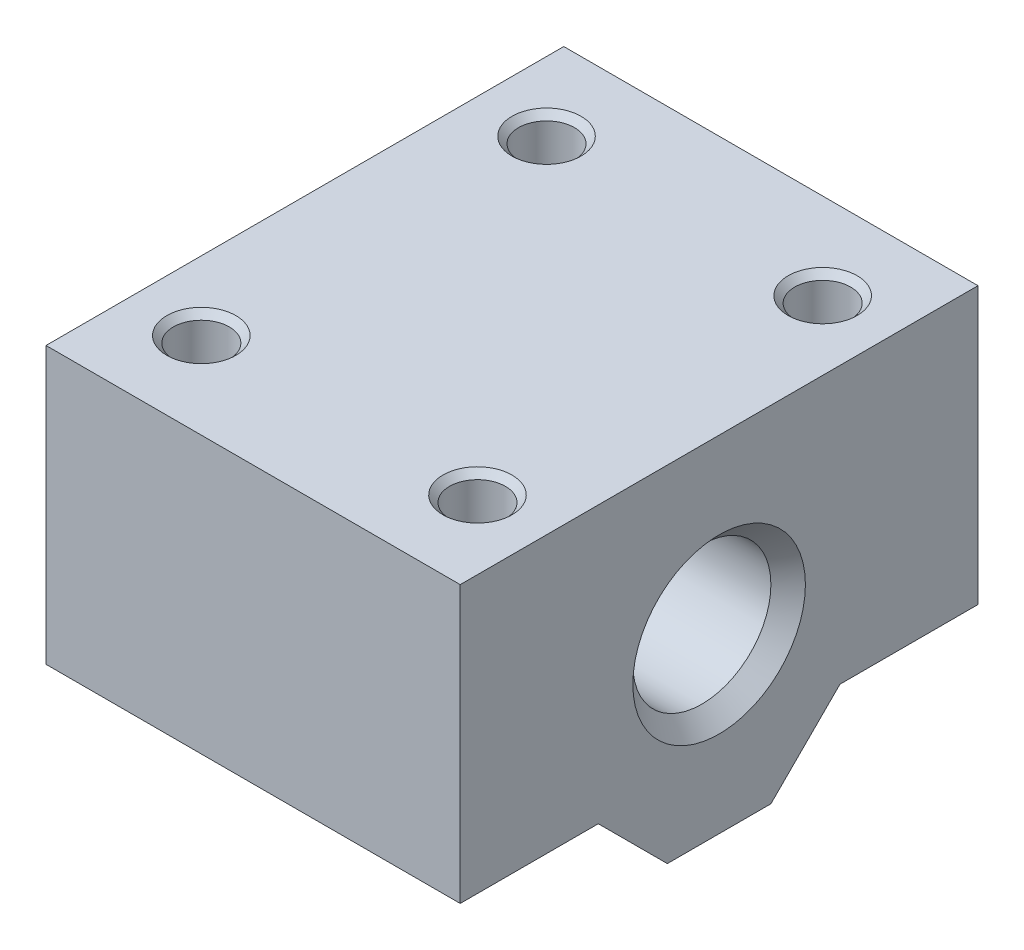
ISO-10303-21;
HEADER;
FILE_DESCRIPTION(('STEP AP214'),'2;1');
FILE_NAME('part.step','',(''),(''),'','','');
FILE_SCHEMA(('AUTOMOTIVE_DESIGN { 1 0 10303 214 1 1 1 1 }'));
ENDSEC;
DATA;
#1=APPLICATION_CONTEXT('core data for automotive mechanical design processes');
#2=APPLICATION_PROTOCOL_DEFINITION('international standard','automotive_design',2000,#1);
#3=PRODUCT_CONTEXT('',#1,'mechanical');
#4=PRODUCT('Part','Part','',(#3));
#5=PRODUCT_RELATED_PRODUCT_CATEGORY('part','',(#4));
#6=PRODUCT_DEFINITION_FORMATION('','',#4);
#7=PRODUCT_DEFINITION_CONTEXT('part definition',#1,'design');
#8=PRODUCT_DEFINITION('design','',#6,#7);
#9=PRODUCT_DEFINITION_SHAPE('','',#8);
#10=(LENGTH_UNIT() NAMED_UNIT(*) SI_UNIT(.MILLI.,.METRE.));
#11=(NAMED_UNIT(*) PLANE_ANGLE_UNIT() SI_UNIT($,.RADIAN.));
#12=(NAMED_UNIT(*) SI_UNIT($,.STERADIAN.) SOLID_ANGLE_UNIT());
#13=UNCERTAINTY_MEASURE_WITH_UNIT(LENGTH_MEASURE(1.E-05),#10,'distance_accuracy_value','');
#14=(GEOMETRIC_REPRESENTATION_CONTEXT(3) GLOBAL_UNCERTAINTY_ASSIGNED_CONTEXT((#13)) GLOBAL_UNIT_ASSIGNED_CONTEXT((#10,
#11,#12)) REPRESENTATION_CONTEXT('',''));
#15=CARTESIAN_POINT('',(0.,0.,0.));
#16=DIRECTION('',(0.,0.,1.));
#17=DIRECTION('',(1.,0.,0.));
#18=AXIS2_PLACEMENT_3D('',#15,#16,#17);
#19=CARTESIAN_POINT('',(24.,-10.,-15.));
#20=DIRECTION('',(0.,0.,-1.));
#21=DIRECTION('',(-1.,0.,0.));
#22=AXIS2_PLACEMENT_3D('',#19,#20,#21);
#23=PLANE('',#22);
#24=DIRECTION('',(1.,0.,0.));
#25=VECTOR('',#24,1.);
#26=CARTESIAN_POINT('',(0.,-6.,-15.));
#27=LINE('',#26,#25);
#28=CARTESIAN_POINT('',(0.,-6.,-15.));
#29=VERTEX_POINT('',#28);
#30=CARTESIAN_POINT('',(24.,-6.,-15.));
#31=VERTEX_POINT('',#30);
#32=EDGE_CURVE('E157',#29,#31,#27,.T.);
#33=ORIENTED_EDGE('',*,*,#32,.F.);
#34=DIRECTION('',(0.,1.,0.));
#35=VECTOR('',#34,1.);
#36=CARTESIAN_POINT('',(0.,-10.,-15.));
#37=LINE('',#36,#35);
#38=CARTESIAN_POINT('',(0.,10.,-15.));
#39=VERTEX_POINT('',#38);
#40=EDGE_CURVE('E128',#29,#39,#37,.T.);
#41=ORIENTED_EDGE('',*,*,#40,.T.);
#42=DIRECTION('',(-1.,0.,0.));
#43=VECTOR('',#42,1.);
#44=CARTESIAN_POINT('',(24.,10.,-15.));
#45=LINE('',#44,#43);
#46=CARTESIAN_POINT('',(24.,10.,-15.));
#47=VERTEX_POINT('',#46);
#48=EDGE_CURVE('E126',#47,#39,#45,.T.);
#49=ORIENTED_EDGE('',*,*,#48,.F.);
#50=DIRECTION('',(0.,1.,0.));
#51=VECTOR('',#50,1.);
#52=CARTESIAN_POINT('',(24.,-10.,-15.));
#53=LINE('',#52,#51);
#54=EDGE_CURVE('E111',#31,#47,#53,.T.);
#55=ORIENTED_EDGE('',*,*,#54,.F.);
#56=EDGE_LOOP('',(#33,#41,#49,#55));
#57=FACE_BOUND('',#56,.T.);
#58=ADVANCED_FACE('F41',(#57),#23,.T.);
#59=CARTESIAN_POINT('',(24.,-10.,15.));
#60=DIRECTION('',(1.,0.,0.));
#61=DIRECTION('',(0.,0.,-1.));
#62=AXIS2_PLACEMENT_3D('',#59,#60,#61);
#63=PLANE('',#62);
#64=CARTESIAN_POINT('',(24.,0.,0.));
#65=DIRECTION('',(1.,0.,0.));
#66=DIRECTION('',(0.,0.,-1.));
#67=AXIS2_PLACEMENT_3D('',#64,#65,#66);
#68=CIRCLE('',#67,4.99999999999999);
#69=CARTESIAN_POINT('',(24.,0.,-4.99999999999999));
#70=VERTEX_POINT('',#69);
#71=EDGE_CURVE('E199',#70,#70,#68,.F.);
#72=ORIENTED_EDGE('',*,*,#71,.T.);
#73=EDGE_LOOP('',(#72));
#74=FACE_BOUND('',#73,.T.);
#75=DIRECTION('',(0.,0.,1.));
#76=VECTOR('',#75,1.);
#77=CARTESIAN_POINT('',(24.,-6.,3.));
#78=LINE('',#77,#76);
#79=CARTESIAN_POINT('',(24.,-6.,7.00000000000003));
#80=VERTEX_POINT('',#79);
#81=CARTESIAN_POINT('',(24.,-6.,15.));
#82=VERTEX_POINT('',#81);
#83=EDGE_CURVE('E87',#80,#82,#78,.T.);
#84=ORIENTED_EDGE('',*,*,#83,.F.);
#85=DIRECTION('',(0.,-0.707106781186545,-0.70710678118655));
#86=VECTOR('',#85,1.);
#87=CARTESIAN_POINT('',(24.,-4.,9.00000000000004));
#88=LINE('',#87,#86);
#89=CARTESIAN_POINT('',(24.,-10.,3.));
#90=VERTEX_POINT('',#89);
#91=EDGE_CURVE('E161',#90,#80,#88,.F.);
#92=ORIENTED_EDGE('',*,*,#91,.F.);
#93=DIRECTION('',(0.,0.,-1.));
#94=VECTOR('',#93,1.);
#95=CARTESIAN_POINT('',(24.,-10.,15.));
#96=LINE('',#95,#94);
#97=CARTESIAN_POINT('',(24.,-10.,-3.));
#98=VERTEX_POINT('',#97);
#99=EDGE_CURVE('E142',#90,#98,#96,.T.);
#100=ORIENTED_EDGE('',*,*,#99,.T.);
#101=DIRECTION('',(0.,0.707106781186545,-0.70710678118655));
#102=VECTOR('',#101,1.);
#103=CARTESIAN_POINT('',(24.,-19.,6.00000000000006));
#104=LINE('',#103,#102);
#105=CARTESIAN_POINT('',(24.,-6.,-7.00000000000003));
#106=VERTEX_POINT('',#105);
#107=EDGE_CURVE('E151',#106,#98,#104,.F.);
#108=ORIENTED_EDGE('',*,*,#107,.F.);
#109=DIRECTION('',(0.,0.,1.));
#110=VECTOR('',#109,1.);
#111=CARTESIAN_POINT('',(24.,-6.,-15.));
#112=LINE('',#111,#110);
#113=EDGE_CURVE('E119',#31,#106,#112,.T.);
#114=ORIENTED_EDGE('',*,*,#113,.F.);
#115=ORIENTED_EDGE('',*,*,#54,.T.);
#116=DIRECTION('',(0.,0.,-1.));
#117=VECTOR('',#116,1.);
#118=CARTESIAN_POINT('',(24.,10.,15.));
#119=LINE('',#118,#117);
#120=CARTESIAN_POINT('',(24.,10.,15.));
#121=VERTEX_POINT('',#120);
#122=EDGE_CURVE('E116',#121,#47,#119,.T.);
#123=ORIENTED_EDGE('',*,*,#122,.F.);
#124=DIRECTION('',(0.,1.,0.));
#125=VECTOR('',#124,1.);
#126=CARTESIAN_POINT('',(24.,-10.,15.));
#127=LINE('',#126,#125);
#128=EDGE_CURVE('E123',#82,#121,#127,.T.);
#129=ORIENTED_EDGE('',*,*,#128,.F.);
#130=EDGE_LOOP('',(#84,#92,#100,#108,#114,#115,#123,#129));
#131=FACE_BOUND('',#130,.T.);
#132=ADVANCED_FACE('F113',(#74,#131),#63,.T.);
#133=CARTESIAN_POINT('',(0.,-10.,15.));
#134=DIRECTION('',(0.,0.,1.));
#135=DIRECTION('',(1.,0.,0.));
#136=AXIS2_PLACEMENT_3D('',#133,#134,#135);
#137=PLANE('',#136);
#138=DIRECTION('',(1.,0.,0.));
#139=VECTOR('',#138,1.);
#140=CARTESIAN_POINT('',(0.,-6.,15.));
#141=LINE('',#140,#139);
#142=CARTESIAN_POINT('',(0.,-6.,15.));
#143=VERTEX_POINT('',#142);
#144=EDGE_CURVE('E167',#143,#82,#141,.T.);
#145=ORIENTED_EDGE('',*,*,#144,.T.);
#146=ORIENTED_EDGE('',*,*,#128,.T.);
#147=DIRECTION('',(1.,0.,0.));
#148=VECTOR('',#147,1.);
#149=CARTESIAN_POINT('',(0.,10.,15.));
#150=LINE('',#149,#148);
#151=CARTESIAN_POINT('',(0.,10.,15.));
#152=VERTEX_POINT('',#151);
#153=EDGE_CURVE('E138',#152,#121,#150,.T.);
#154=ORIENTED_EDGE('',*,*,#153,.F.);
#155=DIRECTION('',(0.,1.,0.));
#156=VECTOR('',#155,1.);
#157=CARTESIAN_POINT('',(0.,-10.,15.));
#158=LINE('',#157,#156);
#159=EDGE_CURVE('E148',#143,#152,#158,.T.);
#160=ORIENTED_EDGE('',*,*,#159,.F.);
#161=EDGE_LOOP('',(#145,#146,#154,#160));
#162=FACE_BOUND('',#161,.T.);
#163=ADVANCED_FACE('F217',(#162),#137,.T.);
#164=CARTESIAN_POINT('',(0.,-10.,-15.));
#165=DIRECTION('',(-1.,0.,0.));
#166=DIRECTION('',(0.,0.,1.));
#167=AXIS2_PLACEMENT_3D('',#164,#165,#166);
#168=PLANE('',#167);
#169=CARTESIAN_POINT('',(0.,0.,0.));
#170=DIRECTION('',(-1.,0.,0.));
#171=DIRECTION('',(0.,0.,1.));
#172=AXIS2_PLACEMENT_3D('',#169,#170,#171);
#173=CIRCLE('',#172,5.);
#174=CARTESIAN_POINT('',(0.,0.,5.));
#175=VERTEX_POINT('',#174);
#176=EDGE_CURVE('E11',#175,#175,#173,.F.);
#177=ORIENTED_EDGE('',*,*,#176,.T.);
#178=EDGE_LOOP('',(#177));
#179=FACE_BOUND('',#178,.T.);
#180=DIRECTION('',(0.,0.,1.));
#181=VECTOR('',#180,1.);
#182=CARTESIAN_POINT('',(0.,-6.,3.));
#183=LINE('',#182,#181);
#184=CARTESIAN_POINT('',(0.,-6.,7.00000000000003));
#185=VERTEX_POINT('',#184);
#186=EDGE_CURVE('E165',#185,#143,#183,.T.);
#187=ORIENTED_EDGE('',*,*,#186,.T.);
#188=ORIENTED_EDGE('',*,*,#159,.T.);
#189=DIRECTION('',(0.,0.,1.));
#190=VECTOR('',#189,1.);
#191=CARTESIAN_POINT('',(0.,10.,-15.));
#192=LINE('',#191,#190);
#193=EDGE_CURVE('E132',#39,#152,#192,.T.);
#194=ORIENTED_EDGE('',*,*,#193,.F.);
#195=ORIENTED_EDGE('',*,*,#40,.F.);
#196=DIRECTION('',(0.,0.,1.));
#197=VECTOR('',#196,1.);
#198=CARTESIAN_POINT('',(0.,-6.,-15.));
#199=LINE('',#198,#197);
#200=CARTESIAN_POINT('',(0.,-6.,-7.00000000000003));
#201=VERTEX_POINT('',#200);
#202=EDGE_CURVE('E154',#29,#201,#199,.T.);
#203=ORIENTED_EDGE('',*,*,#202,.T.);
#204=DIRECTION('',(0.,0.707106781186545,-0.70710678118655));
#205=VECTOR('',#204,1.);
#206=CARTESIAN_POINT('',(0.,-10.,-3.));
#207=LINE('',#206,#205);
#208=CARTESIAN_POINT('',(0.,-10.,-3.));
#209=VERTEX_POINT('',#208);
#210=EDGE_CURVE('E158',#201,#209,#207,.F.);
#211=ORIENTED_EDGE('',*,*,#210,.T.);
#212=DIRECTION('',(0.,0.,1.));
#213=VECTOR('',#212,1.);
#214=CARTESIAN_POINT('',(0.,-10.,-15.));
#215=LINE('',#214,#213);
#216=CARTESIAN_POINT('',(0.,-10.,3.));
#217=VERTEX_POINT('',#216);
#218=EDGE_CURVE('E139',#209,#217,#215,.T.);
#219=ORIENTED_EDGE('',*,*,#218,.T.);
#220=DIRECTION('',(0.,-0.707106781186545,-0.70710678118655));
#221=VECTOR('',#220,1.);
#222=CARTESIAN_POINT('',(0.,-10.,3.));
#223=LINE('',#222,#221);
#224=EDGE_CURVE('E59',#217,#185,#223,.F.);
#225=ORIENTED_EDGE('',*,*,#224,.T.);
#226=EDGE_LOOP('',(#187,#188,#194,#195,#203,#211,#219,#225));
#227=FACE_BOUND('',#226,.T.);
#228=ADVANCED_FACE('F223',(#179,#227),#168,.T.);
#229=CARTESIAN_POINT('',(0.,-10.,0.));
#230=DIRECTION('',(0.,1.,0.));
#231=DIRECTION('',(0.,0.,1.));
#232=AXIS2_PLACEMENT_3D('',#229,#230,#231);
#233=PLANE('',#232);
#234=ORIENTED_EDGE('',*,*,#99,.F.);
#235=DIRECTION('',(1.,0.,0.));
#236=VECTOR('',#235,1.);
#237=CARTESIAN_POINT('',(0.,-10.,3.));
#238=LINE('',#237,#236);
#239=EDGE_CURVE('E168',#217,#90,#238,.T.);
#240=ORIENTED_EDGE('',*,*,#239,.F.);
#241=ORIENTED_EDGE('',*,*,#218,.F.);
#242=DIRECTION('',(1.,0.,0.));
#243=VECTOR('',#242,1.);
#244=CARTESIAN_POINT('',(0.,-10.,-3.));
#245=LINE('',#244,#243);
#246=EDGE_CURVE('E133',#209,#98,#245,.T.);
#247=ORIENTED_EDGE('',*,*,#246,.T.);
#248=EDGE_LOOP('',(#234,#240,#241,#247));
#249=FACE_BOUND('',#248,.T.);
#250=ADVANCED_FACE('F231',(#249),#233,.F.);
#251=CARTESIAN_POINT('',(0.,10.,0.));
#252=DIRECTION('',(0.,1.,0.));
#253=DIRECTION('',(0.,0.,1.));
#254=AXIS2_PLACEMENT_3D('',#251,#252,#253);
#255=PLANE('',#254);
#256=CARTESIAN_POINT('',(20.,10.,-10.));
#257=DIRECTION('',(0.,1.,0.));
#258=DIRECTION('',(0.,0.,1.));
#259=AXIS2_PLACEMENT_3D('',#256,#257,#258);
#260=CIRCLE('',#259,1.99999999999998);
#261=CARTESIAN_POINT('',(20.,10.,-8.00000000000002));
#262=VERTEX_POINT('',#261);
#263=EDGE_CURVE('E187',#262,#262,#260,.F.);
#264=ORIENTED_EDGE('',*,*,#263,.T.);
#265=EDGE_LOOP('',(#264));
#266=FACE_BOUND('',#265,.T.);
#267=CARTESIAN_POINT('',(4.,10.,10.));
#268=DIRECTION('',(0.,1.,0.));
#269=DIRECTION('',(0.,0.,1.));
#270=AXIS2_PLACEMENT_3D('',#267,#268,#269);
#271=CIRCLE('',#270,2.00000000000001);
#272=CARTESIAN_POINT('',(4.,10.,12.));
#273=VERTEX_POINT('',#272);
#274=EDGE_CURVE('E184',#273,#273,#271,.F.);
#275=ORIENTED_EDGE('',*,*,#274,.T.);
#276=EDGE_LOOP('',(#275));
#277=FACE_BOUND('',#276,.T.);
#278=CARTESIAN_POINT('',(20.,10.,10.));
#279=DIRECTION('',(0.,1.,0.));
#280=DIRECTION('',(0.,0.,1.));
#281=AXIS2_PLACEMENT_3D('',#278,#279,#280);
#282=CIRCLE('',#281,2.00000000000001);
#283=CARTESIAN_POINT('',(20.,10.,12.));
#284=VERTEX_POINT('',#283);
#285=EDGE_CURVE('E181',#284,#284,#282,.F.);
#286=ORIENTED_EDGE('',*,*,#285,.T.);
#287=EDGE_LOOP('',(#286));
#288=FACE_BOUND('',#287,.T.);
#289=CARTESIAN_POINT('',(4.,10.,-10.));
#290=DIRECTION('',(0.,1.,0.));
#291=DIRECTION('',(0.,0.,1.));
#292=AXIS2_PLACEMENT_3D('',#289,#290,#291);
#293=CIRCLE('',#292,1.99999999999998);
#294=CARTESIAN_POINT('',(4.,10.,-8.00000000000002));
#295=VERTEX_POINT('',#294);
#296=EDGE_CURVE('E178',#295,#295,#293,.F.);
#297=ORIENTED_EDGE('',*,*,#296,.T.);
#298=EDGE_LOOP('',(#297));
#299=FACE_BOUND('',#298,.T.);
#300=ORIENTED_EDGE('',*,*,#48,.T.);
#301=ORIENTED_EDGE('',*,*,#193,.T.);
#302=ORIENTED_EDGE('',*,*,#153,.T.);
#303=ORIENTED_EDGE('',*,*,#122,.T.);
#304=EDGE_LOOP('',(#300,#301,#302,#303));
#305=FACE_BOUND('',#304,.T.);
#306=ADVANCED_FACE('F136',(#266,#277,#288,#299,#305),#255,.T.);
#307=CARTESIAN_POINT('',(0.,-10.,-3.));
#308=DIRECTION('',(0.,-0.70710678118655,-0.707106781186545));
#309=DIRECTION('',(0.,0.707106781186545,-0.70710678118655));
#310=AXIS2_PLACEMENT_3D('',#307,#308,#309);
#311=PLANE('',#310);
#312=ORIENTED_EDGE('',*,*,#107,.T.);
#313=ORIENTED_EDGE('',*,*,#246,.F.);
#314=ORIENTED_EDGE('',*,*,#210,.F.);
#315=DIRECTION('',(-1.,0.,0.));
#316=VECTOR('',#315,1.);
#317=CARTESIAN_POINT('',(0.,-6.,-7.00000000000003));
#318=LINE('',#317,#316);
#319=EDGE_CURVE('E155',#201,#106,#318,.F.);
#320=ORIENTED_EDGE('',*,*,#319,.T.);
#321=EDGE_LOOP('',(#312,#313,#314,#320));
#322=FACE_BOUND('',#321,.T.);
#323=ADVANCED_FACE('F234',(#322),#311,.T.);
#324=CARTESIAN_POINT('',(0.,-6.,-15.));
#325=DIRECTION('',(0.,1.,0.));
#326=DIRECTION('',(0.,0.,1.));
#327=AXIS2_PLACEMENT_3D('',#324,#325,#326);
#328=PLANE('',#327);
#329=CARTESIAN_POINT('',(4.,-6.,-10.));
#330=DIRECTION('',(0.,1.,0.));
#331=DIRECTION('',(0.,0.,1.));
#332=AXIS2_PLACEMENT_3D('',#329,#330,#331);
#333=CIRCLE('',#332,1.62099999999999);
#334=CARTESIAN_POINT('',(4.,-6.,-8.37900000000002));
#335=VERTEX_POINT('',#334);
#336=EDGE_CURVE('E171',#335,#335,#333,.T.);
#337=ORIENTED_EDGE('',*,*,#336,.T.);
#338=EDGE_LOOP('',(#337));
#339=FACE_BOUND('',#338,.T.);
#340=CARTESIAN_POINT('',(20.,-6.,-10.));
#341=DIRECTION('',(0.,1.,0.));
#342=DIRECTION('',(0.,0.,1.));
#343=AXIS2_PLACEMENT_3D('',#340,#341,#342);
#344=CIRCLE('',#343,1.62099999999999);
#345=CARTESIAN_POINT('',(20.,-6.,-8.37900000000002));
#346=VERTEX_POINT('',#345);
#347=EDGE_CURVE('E163',#346,#346,#344,.T.);
#348=ORIENTED_EDGE('',*,*,#347,.T.);
#349=EDGE_LOOP('',(#348));
#350=FACE_BOUND('',#349,.T.);
#351=ORIENTED_EDGE('',*,*,#113,.T.);
#352=ORIENTED_EDGE('',*,*,#319,.F.);
#353=ORIENTED_EDGE('',*,*,#202,.F.);
#354=ORIENTED_EDGE('',*,*,#32,.T.);
#355=EDGE_LOOP('',(#351,#352,#353,#354));
#356=FACE_BOUND('',#355,.T.);
#357=ADVANCED_FACE('F237',(#339,#350,#356),#328,.F.);
#358=CARTESIAN_POINT('',(0.,-6.,3.));
#359=DIRECTION('',(0.,1.,0.));
#360=DIRECTION('',(0.,0.,1.));
#361=AXIS2_PLACEMENT_3D('',#358,#359,#360);
#362=PLANE('',#361);
#363=CARTESIAN_POINT('',(20.,-6.,10.));
#364=DIRECTION('',(0.,1.,0.));
#365=DIRECTION('',(0.,0.,1.));
#366=AXIS2_PLACEMENT_3D('',#363,#364,#365);
#367=CIRCLE('',#366,1.62099999999999);
#368=CARTESIAN_POINT('',(20.,-6.,11.621));
#369=VERTEX_POINT('',#368);
#370=EDGE_CURVE('E172',#369,#369,#367,.T.);
#371=ORIENTED_EDGE('',*,*,#370,.T.);
#372=EDGE_LOOP('',(#371));
#373=FACE_BOUND('',#372,.T.);
#374=CARTESIAN_POINT('',(4.,-6.,10.));
#375=DIRECTION('',(0.,1.,0.));
#376=DIRECTION('',(0.,0.,1.));
#377=AXIS2_PLACEMENT_3D('',#374,#375,#376);
#378=CIRCLE('',#377,1.62099999999999);
#379=CARTESIAN_POINT('',(4.,-6.,11.621));
#380=VERTEX_POINT('',#379);
#381=EDGE_CURVE('E175',#380,#380,#378,.T.);
#382=ORIENTED_EDGE('',*,*,#381,.T.);
#383=EDGE_LOOP('',(#382));
#384=FACE_BOUND('',#383,.T.);
#385=ORIENTED_EDGE('',*,*,#83,.T.);
#386=ORIENTED_EDGE('',*,*,#144,.F.);
#387=ORIENTED_EDGE('',*,*,#186,.F.);
#388=DIRECTION('',(-1.,0.,0.));
#389=VECTOR('',#388,1.);
#390=CARTESIAN_POINT('',(0.,-6.,7.00000000000003));
#391=LINE('',#390,#389);
#392=EDGE_CURVE('E79',#185,#80,#391,.F.);
#393=ORIENTED_EDGE('',*,*,#392,.T.);
#394=EDGE_LOOP('',(#385,#386,#387,#393));
#395=FACE_BOUND('',#394,.T.);
#396=ADVANCED_FACE('F242',(#373,#384,#395),#362,.F.);
#397=CARTESIAN_POINT('',(0.,-10.,3.));
#398=DIRECTION('',(0.,-0.70710678118655,0.707106781186545));
#399=DIRECTION('',(0.,-0.707106781186545,-0.70710678118655));
#400=AXIS2_PLACEMENT_3D('',#397,#398,#399);
#401=PLANE('',#400);
#402=ORIENTED_EDGE('',*,*,#91,.T.);
#403=ORIENTED_EDGE('',*,*,#392,.F.);
#404=ORIENTED_EDGE('',*,*,#224,.F.);
#405=ORIENTED_EDGE('',*,*,#239,.T.);
#406=EDGE_LOOP('',(#402,#403,#404,#405));
#407=FACE_BOUND('',#406,.T.);
#408=ADVANCED_FACE('F239',(#407),#401,.T.);
#409=CARTESIAN_POINT('',(0.,0.,0.));
#410=DIRECTION('',(-1.,0.,0.));
#411=DIRECTION('',(0.,0.,1.));
#412=AXIS2_PLACEMENT_3D('',#409,#410,#411);
#413=CYLINDRICAL_SURFACE('',#412,3.99999999999999);
#414=CARTESIAN_POINT('',(23.,0.,0.));
#415=DIRECTION('',(1.,0.,0.));
#416=DIRECTION('',(0.,0.,-1.));
#417=AXIS2_PLACEMENT_3D('',#414,#415,#416);
#418=CIRCLE('',#417,3.99999999999999);
#419=CARTESIAN_POINT('',(23.,0.,-3.99999999999999));
#420=VERTEX_POINT('',#419);
#421=EDGE_CURVE('E51',#420,#420,#418,.T.);
#422=ORIENTED_EDGE('',*,*,#421,.T.);
#423=EDGE_LOOP('',(#422));
#424=FACE_BOUND('',#423,.T.);
#425=CARTESIAN_POINT('',(1.,0.,0.));
#426=DIRECTION('',(-1.,0.,0.));
#427=DIRECTION('',(0.,0.,1.));
#428=AXIS2_PLACEMENT_3D('',#425,#426,#427);
#429=CIRCLE('',#428,3.99999999999999);
#430=CARTESIAN_POINT('',(1.,0.,3.99999999999999));
#431=VERTEX_POINT('',#430);
#432=EDGE_CURVE('E202',#431,#431,#429,.T.);
#433=ORIENTED_EDGE('',*,*,#432,.T.);
#434=EDGE_LOOP('',(#433));
#435=FACE_BOUND('',#434,.T.);
#436=ADVANCED_FACE('F207',(#424,#435),#413,.F.);
#437=CARTESIAN_POINT('',(20.,10.,-10.));
#438=DIRECTION('',(0.,1.,0.));
#439=DIRECTION('',(0.,0.,1.));
#440=AXIS2_PLACEMENT_3D('',#437,#438,#439);
#441=CYLINDRICAL_SURFACE('',#440,1.62099999999999);
#442=CARTESIAN_POINT('',(20.,9.62100000000001,-10.));
#443=DIRECTION('',(0.,1.,0.));
#444=DIRECTION('',(0.,0.,1.));
#445=AXIS2_PLACEMENT_3D('',#442,#443,#444);
#446=CIRCLE('',#445,1.62099999999999);
#447=CARTESIAN_POINT('',(20.,9.62100000000001,-8.37900000000002));
#448=VERTEX_POINT('',#447);
#449=EDGE_CURVE('E122',#448,#448,#446,.T.);
#450=ORIENTED_EDGE('',*,*,#449,.T.);
#451=EDGE_LOOP('',(#450));
#452=FACE_BOUND('',#451,.T.);
#453=ORIENTED_EDGE('',*,*,#347,.F.);
#454=EDGE_LOOP('',(#453));
#455=FACE_BOUND('',#454,.T.);
#456=ADVANCED_FACE('F285',(#452,#455),#441,.F.);
#457=CARTESIAN_POINT('',(4.,10.,-10.));
#458=DIRECTION('',(0.,1.,0.));
#459=DIRECTION('',(0.,0.,1.));
#460=AXIS2_PLACEMENT_3D('',#457,#458,#459);
#461=CYLINDRICAL_SURFACE('',#460,1.62099999999999);
#462=CARTESIAN_POINT('',(4.,9.62100000000001,-10.));
#463=DIRECTION('',(0.,1.,0.));
#464=DIRECTION('',(0.,0.,1.));
#465=AXIS2_PLACEMENT_3D('',#462,#463,#464);
#466=CIRCLE('',#465,1.62099999999999);
#467=CARTESIAN_POINT('',(4.,9.62100000000001,-8.37900000000002));
#468=VERTEX_POINT('',#467);
#469=EDGE_CURVE('E196',#468,#468,#466,.T.);
#470=ORIENTED_EDGE('',*,*,#469,.T.);
#471=EDGE_LOOP('',(#470));
#472=FACE_BOUND('',#471,.T.);
#473=ORIENTED_EDGE('',*,*,#336,.F.);
#474=EDGE_LOOP('',(#473));
#475=FACE_BOUND('',#474,.T.);
#476=ADVANCED_FACE('F281',(#472,#475),#461,.F.);
#477=CARTESIAN_POINT('',(4.,10.,10.));
#478=DIRECTION('',(0.,1.,0.));
#479=DIRECTION('',(0.,0.,1.));
#480=AXIS2_PLACEMENT_3D('',#477,#478,#479);
#481=CYLINDRICAL_SURFACE('',#480,1.62099999999999);
#482=CARTESIAN_POINT('',(4.,9.62099999999999,10.));
#483=DIRECTION('',(0.,1.,0.));
#484=DIRECTION('',(0.,0.,1.));
#485=AXIS2_PLACEMENT_3D('',#482,#483,#484);
#486=CIRCLE('',#485,1.62099999999999);
#487=CARTESIAN_POINT('',(4.,9.62099999999999,11.621));
#488=VERTEX_POINT('',#487);
#489=EDGE_CURVE('E190',#488,#488,#486,.T.);
#490=ORIENTED_EDGE('',*,*,#489,.T.);
#491=EDGE_LOOP('',(#490));
#492=FACE_BOUND('',#491,.T.);
#493=ORIENTED_EDGE('',*,*,#381,.F.);
#494=EDGE_LOOP('',(#493));
#495=FACE_BOUND('',#494,.T.);
#496=ADVANCED_FACE('F284',(#492,#495),#481,.F.);
#497=CARTESIAN_POINT('',(20.,10.,10.));
#498=DIRECTION('',(0.,1.,0.));
#499=DIRECTION('',(0.,0.,1.));
#500=AXIS2_PLACEMENT_3D('',#497,#498,#499);
#501=CYLINDRICAL_SURFACE('',#500,1.62099999999999);
#502=CARTESIAN_POINT('',(20.,9.62099999999999,10.));
#503=DIRECTION('',(0.,1.,0.));
#504=DIRECTION('',(0.,0.,1.));
#505=AXIS2_PLACEMENT_3D('',#502,#503,#504);
#506=CIRCLE('',#505,1.62099999999999);
#507=CARTESIAN_POINT('',(20.,9.62099999999999,11.621));
#508=VERTEX_POINT('',#507);
#509=EDGE_CURVE('E193',#508,#508,#506,.T.);
#510=ORIENTED_EDGE('',*,*,#509,.T.);
#511=EDGE_LOOP('',(#510));
#512=FACE_BOUND('',#511,.T.);
#513=ORIENTED_EDGE('',*,*,#370,.F.);
#514=EDGE_LOOP('',(#513));
#515=FACE_BOUND('',#514,.T.);
#516=ADVANCED_FACE('F251',(#512,#515),#501,.F.);
#517=CARTESIAN_POINT('',(20.,9.62100000000001,-10.));
#518=DIRECTION('',(0.,1.,0.));
#519=DIRECTION('',(0.,0.,1.));
#520=AXIS2_PLACEMENT_3D('',#517,#518,#519);
#521=CONICAL_SURFACE('',#520,1.62099999999999,0.785398163397457);
#522=ORIENTED_EDGE('',*,*,#263,.F.);
#523=EDGE_LOOP('',(#522));
#524=FACE_BOUND('',#523,.T.);
#525=ORIENTED_EDGE('',*,*,#449,.F.);
#526=EDGE_LOOP('',(#525));
#527=FACE_BOUND('',#526,.T.);
#528=ADVANCED_FACE('F244',(#524,#527),#521,.F.);
#529=CARTESIAN_POINT('',(4.,9.62099999999999,10.));
#530=DIRECTION('',(0.,1.,0.));
#531=DIRECTION('',(0.,0.,1.));
#532=AXIS2_PLACEMENT_3D('',#529,#530,#531);
#533=CONICAL_SURFACE('',#532,1.62099999999999,0.785398163397457);
#534=ORIENTED_EDGE('',*,*,#274,.F.);
#535=EDGE_LOOP('',(#534));
#536=FACE_BOUND('',#535,.T.);
#537=ORIENTED_EDGE('',*,*,#489,.F.);
#538=EDGE_LOOP('',(#537));
#539=FACE_BOUND('',#538,.T.);
#540=ADVANCED_FACE('F250',(#536,#539),#533,.F.);
#541=CARTESIAN_POINT('',(20.,9.62099999999999,10.));
#542=DIRECTION('',(0.,1.,0.));
#543=DIRECTION('',(0.,0.,1.));
#544=AXIS2_PLACEMENT_3D('',#541,#542,#543);
#545=CONICAL_SURFACE('',#544,1.62099999999999,0.785398163397457);
#546=ORIENTED_EDGE('',*,*,#285,.F.);
#547=EDGE_LOOP('',(#546));
#548=FACE_BOUND('',#547,.T.);
#549=ORIENTED_EDGE('',*,*,#509,.F.);
#550=EDGE_LOOP('',(#549));
#551=FACE_BOUND('',#550,.T.);
#552=ADVANCED_FACE('F258',(#548,#551),#545,.F.);
#553=CARTESIAN_POINT('',(4.,9.62100000000001,-10.));
#554=DIRECTION('',(0.,1.,0.));
#555=DIRECTION('',(0.,0.,1.));
#556=AXIS2_PLACEMENT_3D('',#553,#554,#555);
#557=CONICAL_SURFACE('',#556,1.62099999999999,0.785398163397457);
#558=ORIENTED_EDGE('',*,*,#296,.F.);
#559=EDGE_LOOP('',(#558));
#560=FACE_BOUND('',#559,.T.);
#561=ORIENTED_EDGE('',*,*,#469,.F.);
#562=EDGE_LOOP('',(#561));
#563=FACE_BOUND('',#562,.T.);
#564=ADVANCED_FACE('F213',(#560,#563),#557,.F.);
#565=CARTESIAN_POINT('',(24.,0.,0.));
#566=DIRECTION('',(1.,0.,0.));
#567=DIRECTION('',(0.,0.,-1.));
#568=AXIS2_PLACEMENT_3D('',#565,#566,#567);
#569=CONICAL_SURFACE('',#568,4.99999999999999,0.785398163397447);
#570=ORIENTED_EDGE('',*,*,#421,.F.);
#571=EDGE_LOOP('',(#570));
#572=FACE_BOUND('',#571,.T.);
#573=ORIENTED_EDGE('',*,*,#71,.F.);
#574=EDGE_LOOP('',(#573));
#575=FACE_BOUND('',#574,.T.);
#576=ADVANCED_FACE('F210',(#572,#575),#569,.F.);
#577=CARTESIAN_POINT('',(1.,0.,0.));
#578=DIRECTION('',(-1.,0.,0.));
#579=DIRECTION('',(0.,0.,1.));
#580=AXIS2_PLACEMENT_3D('',#577,#578,#579);
#581=CONICAL_SURFACE('',#580,3.99999999999999,0.785398163397454);
#582=ORIENTED_EDGE('',*,*,#176,.F.);
#583=EDGE_LOOP('',(#582));
#584=FACE_BOUND('',#583,.T.);
#585=ORIENTED_EDGE('',*,*,#432,.F.);
#586=EDGE_LOOP('',(#585));
#587=FACE_BOUND('',#586,.T.);
#588=ADVANCED_FACE('F44',(#584,#587),#581,.F.);
#589=CLOSED_SHELL('',(#58,#132,#163,#228,#250,#306,#323,#357,#396,#408,#436,#456,#476,#496,#516,
#528,#540,#552,#564,#576,#588));
#590=MANIFOLD_SOLID_BREP('B2',#589);
#591=ADVANCED_BREP_SHAPE_REPRESENTATION('',(#18,#590),#14);
#592=SHAPE_DEFINITION_REPRESENTATION(#9,#591);
ENDSEC;
END-ISO-10303-21;
